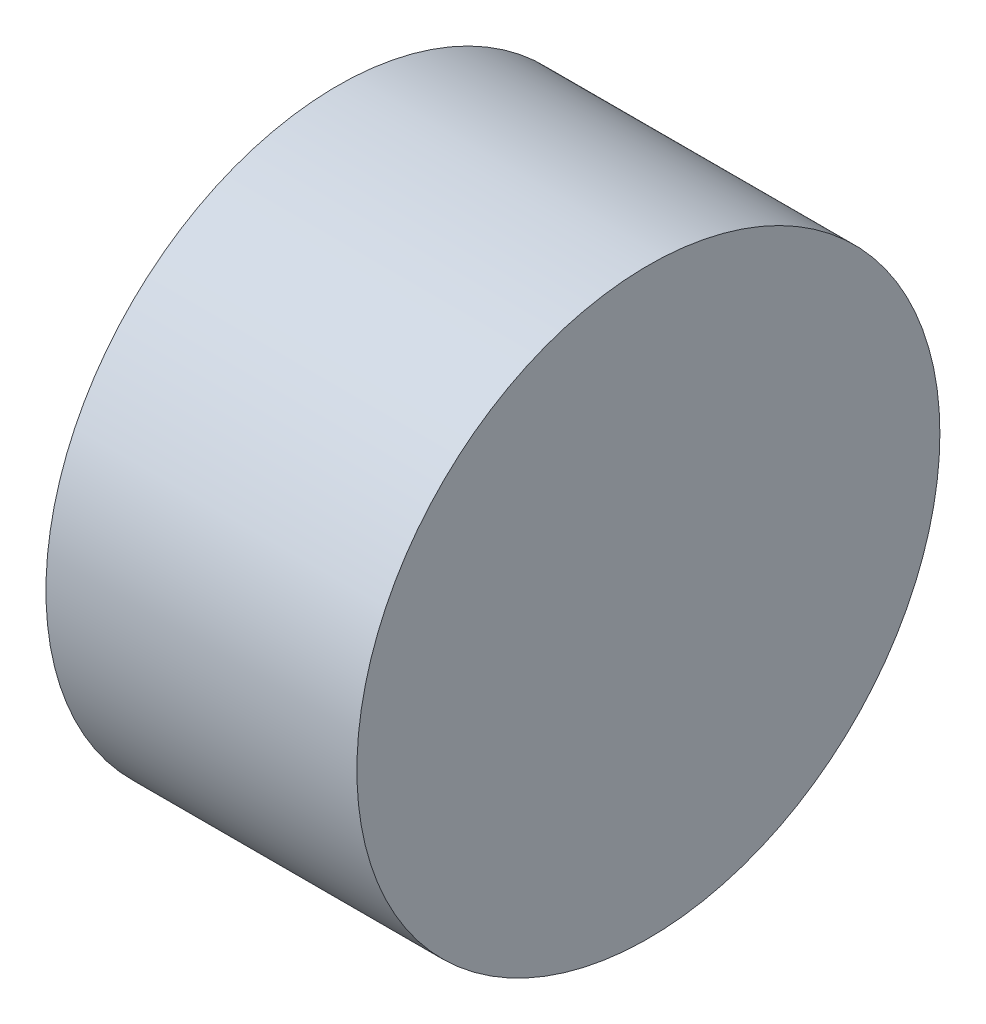
ISO-10303-21;
HEADER;
FILE_DESCRIPTION(('STEP AP214'),'2;1');
FILE_NAME('part.step','',(''),(''),'','','');
FILE_SCHEMA(('AUTOMOTIVE_DESIGN { 1 0 10303 214 1 1 1 1 }'));
ENDSEC;
DATA;
#1=APPLICATION_CONTEXT('core data for automotive mechanical design processes');
#2=APPLICATION_PROTOCOL_DEFINITION('international standard','automotive_design',2000,#1);
#3=PRODUCT_CONTEXT('',#1,'mechanical');
#4=PRODUCT('Part','Part','',(#3));
#5=PRODUCT_RELATED_PRODUCT_CATEGORY('part','',(#4));
#6=PRODUCT_DEFINITION_FORMATION('','',#4);
#7=PRODUCT_DEFINITION_CONTEXT('part definition',#1,'design');
#8=PRODUCT_DEFINITION('design','',#6,#7);
#9=PRODUCT_DEFINITION_SHAPE('','',#8);
#10=(LENGTH_UNIT() NAMED_UNIT(*) SI_UNIT(.MILLI.,.METRE.));
#11=(NAMED_UNIT(*) PLANE_ANGLE_UNIT() SI_UNIT($,.RADIAN.));
#12=(NAMED_UNIT(*) SI_UNIT($,.STERADIAN.) SOLID_ANGLE_UNIT());
#13=UNCERTAINTY_MEASURE_WITH_UNIT(LENGTH_MEASURE(1.E-05),#10,'distance_accuracy_value','');
#14=(GEOMETRIC_REPRESENTATION_CONTEXT(3) GLOBAL_UNCERTAINTY_ASSIGNED_CONTEXT((#13)) GLOBAL_UNIT_ASSIGNED_CONTEXT((#10,
#11,#12)) REPRESENTATION_CONTEXT('',''));
#15=CARTESIAN_POINT('',(0.,0.,0.));
#16=DIRECTION('',(0.,0.,1.));
#17=DIRECTION('',(1.,0.,0.));
#18=AXIS2_PLACEMENT_3D('',#15,#16,#17);
#19=CARTESIAN_POINT('',(-16.9279639675137,803.467614781063,285.214044324484));
#20=DIRECTION('',(-1.,-2.70868752500611E-12,-4.69147808375548E-12));
#21=DIRECTION('',(-4.69147808375548E-12,0.,1.));
#22=AXIS2_PLACEMENT_3D('',#19,#20,#21);
#23=CYLINDRICAL_SURFACE('',#22,11.2500000000001);
#24=CARTESIAN_POINT('',(-16.9279639675137,803.467614781063,285.214044324484));
#25=DIRECTION('',(1.,2.70868752500611E-12,4.69147808375548E-12));
#26=DIRECTION('',(4.69147808375548E-12,0.,-1.));
#27=AXIS2_PLACEMENT_3D('',#24,#25,#26);
#28=CIRCLE('',#27,11.2500000000001);
#29=CARTESIAN_POINT('',(-16.9279639674609,803.467614781063,273.964044324484));
#30=VERTEX_POINT('',#29);
#31=EDGE_CURVE('E10',#30,#30,#28,.T.);
#32=ORIENTED_EDGE('',*,*,#31,.F.);
#33=EDGE_LOOP('',(#32));
#34=FACE_BOUND('',#33,.T.);
#35=CARTESIAN_POINT('',(-28.9279639675137,803.46761478103,285.214044324427));
#36=DIRECTION('',(1.,2.70868752500611E-12,4.69147808375548E-12));
#37=DIRECTION('',(4.69147808375548E-12,0.,-1.));
#38=AXIS2_PLACEMENT_3D('',#35,#36,#37);
#39=CIRCLE('',#38,11.2500000000001);
#40=CARTESIAN_POINT('',(-28.9279639674609,803.46761478103,273.964044324427));
#41=VERTEX_POINT('',#40);
#42=EDGE_CURVE('E42',#41,#41,#39,.T.);
#43=ORIENTED_EDGE('',*,*,#42,.T.);
#44=EDGE_LOOP('',(#43));
#45=FACE_BOUND('',#44,.T.);
#46=ADVANCED_FACE('F39',(#34,#45),#23,.T.);
#47=CARTESIAN_POINT('',(-16.9279639675137,803.467614781063,285.214044324484));
#48=DIRECTION('',(1.,2.70868752500611E-12,4.69147808375548E-12));
#49=DIRECTION('',(4.69147808375548E-12,0.,-1.));
#50=AXIS2_PLACEMENT_3D('',#47,#48,#49);
#51=PLANE('',#50);
#52=ORIENTED_EDGE('',*,*,#31,.T.);
#53=EDGE_LOOP('',(#52));
#54=FACE_BOUND('',#53,.T.);
#55=ADVANCED_FACE('F54',(#54),#51,.T.);
#56=CARTESIAN_POINT('',(-28.9279639675137,803.46761478103,285.214044324427));
#57=DIRECTION('',(1.,2.70868752500611E-12,4.69147808375548E-12));
#58=DIRECTION('',(4.69147808375548E-12,0.,-1.));
#59=AXIS2_PLACEMENT_3D('',#56,#57,#58);
#60=PLANE('',#59);
#61=ORIENTED_EDGE('',*,*,#42,.F.);
#62=EDGE_LOOP('',(#61));
#63=FACE_BOUND('',#62,.T.);
#64=ADVANCED_FACE('F52',(#63),#60,.F.);
#65=CLOSED_SHELL('',(#46,#55,#64));
#66=MANIFOLD_SOLID_BREP('B2',#65);
#67=ADVANCED_BREP_SHAPE_REPRESENTATION('',(#18,#66),#14);
#68=SHAPE_DEFINITION_REPRESENTATION(#9,#67);
ENDSEC;
END-ISO-10303-21;
